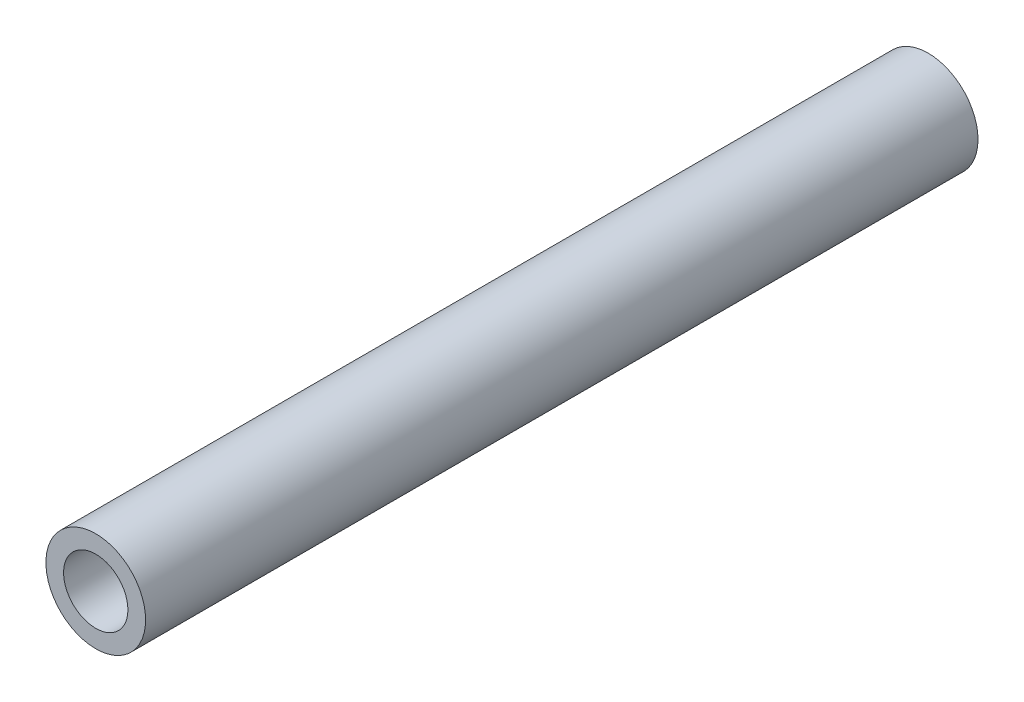
ISO-10303-21;
HEADER;
FILE_DESCRIPTION(('STEP AP214'),'2;1');
FILE_NAME('part.step','',(''),(''),'','','');
FILE_SCHEMA(('AUTOMOTIVE_DESIGN { 1 0 10303 214 1 1 1 1 }'));
ENDSEC;
DATA;
#1=APPLICATION_CONTEXT('core data for automotive mechanical design processes');
#2=APPLICATION_PROTOCOL_DEFINITION('international standard','automotive_design',2000,#1);
#3=PRODUCT_CONTEXT('',#1,'mechanical');
#4=PRODUCT('Part','Part','',(#3));
#5=PRODUCT_RELATED_PRODUCT_CATEGORY('part','',(#4));
#6=PRODUCT_DEFINITION_FORMATION('','',#4);
#7=PRODUCT_DEFINITION_CONTEXT('part definition',#1,'design');
#8=PRODUCT_DEFINITION('design','',#6,#7);
#9=PRODUCT_DEFINITION_SHAPE('','',#8);
#10=(LENGTH_UNIT() NAMED_UNIT(*) SI_UNIT(.MILLI.,.METRE.));
#11=(NAMED_UNIT(*) PLANE_ANGLE_UNIT() SI_UNIT($,.RADIAN.));
#12=(NAMED_UNIT(*) SI_UNIT($,.STERADIAN.) SOLID_ANGLE_UNIT());
#13=UNCERTAINTY_MEASURE_WITH_UNIT(LENGTH_MEASURE(1.E-05),#10,'distance_accuracy_value','');
#14=(GEOMETRIC_REPRESENTATION_CONTEXT(3) GLOBAL_UNCERTAINTY_ASSIGNED_CONTEXT((#13)) GLOBAL_UNIT_ASSIGNED_CONTEXT((#10,
#11,#12)) REPRESENTATION_CONTEXT('',''));
#15=CARTESIAN_POINT('',(0.,0.,0.));
#16=DIRECTION('',(0.,0.,1.));
#17=DIRECTION('',(1.,0.,0.));
#18=AXIS2_PLACEMENT_3D('',#15,#16,#17);
#19=CARTESIAN_POINT('',(0.,0.,66.802));
#20=DIRECTION('',(0.,0.,1.));
#21=DIRECTION('',(1.,0.,0.));
#22=AXIS2_PLACEMENT_3D('',#19,#20,#21);
#23=PLANE('',#22);
#24=CARTESIAN_POINT('',(0.,0.,66.802));
#25=DIRECTION('',(0.,0.,1.));
#26=DIRECTION('',(1.,0.,0.));
#27=AXIS2_PLACEMENT_3D('',#24,#25,#26);
#28=CIRCLE('',#27,4.);
#29=CARTESIAN_POINT('',(4.,0.,66.802));
#30=VERTEX_POINT('',#29);
#31=EDGE_CURVE('E10',#30,#30,#28,.T.);
#32=ORIENTED_EDGE('',*,*,#31,.T.);
#33=EDGE_LOOP('',(#32));
#34=FACE_BOUND('',#33,.T.);
#35=CARTESIAN_POINT('',(0.,0.,66.802));
#36=DIRECTION('',(0.,0.,1.));
#37=DIRECTION('',(1.,0.,0.));
#38=AXIS2_PLACEMENT_3D('',#35,#36,#37);
#39=CIRCLE('',#38,2.58037788044396);
#40=CARTESIAN_POINT('',(2.58037788044396,0.,66.802));
#41=VERTEX_POINT('',#40);
#42=EDGE_CURVE('E44',#41,#41,#39,.T.);
#43=ORIENTED_EDGE('',*,*,#42,.F.);
#44=EDGE_LOOP('',(#43));
#45=FACE_BOUND('',#44,.T.);
#46=ADVANCED_FACE('F33',(#34,#45),#23,.T.);
#47=CARTESIAN_POINT('',(0.,0.,0.));
#48=DIRECTION('',(0.,0.,1.));
#49=DIRECTION('',(1.,0.,0.));
#50=AXIS2_PLACEMENT_3D('',#47,#48,#49);
#51=PLANE('',#50);
#52=CARTESIAN_POINT('',(0.,0.,0.));
#53=DIRECTION('',(0.,0.,1.));
#54=DIRECTION('',(1.,0.,0.));
#55=AXIS2_PLACEMENT_3D('',#52,#53,#54);
#56=CIRCLE('',#55,4.);
#57=CARTESIAN_POINT('',(4.,0.,0.));
#58=VERTEX_POINT('',#57);
#59=EDGE_CURVE('E37',#58,#58,#56,.T.);
#60=ORIENTED_EDGE('',*,*,#59,.F.);
#61=EDGE_LOOP('',(#60));
#62=FACE_BOUND('',#61,.T.);
#63=CARTESIAN_POINT('',(0.,0.,0.));
#64=DIRECTION('',(0.,0.,1.));
#65=DIRECTION('',(1.,0.,0.));
#66=AXIS2_PLACEMENT_3D('',#63,#64,#65);
#67=CIRCLE('',#66,2.58037788044396);
#68=CARTESIAN_POINT('',(2.58037788044396,0.,0.));
#69=VERTEX_POINT('',#68);
#70=EDGE_CURVE('E46',#69,#69,#67,.T.);
#71=ORIENTED_EDGE('',*,*,#70,.T.);
#72=EDGE_LOOP('',(#71));
#73=FACE_BOUND('',#72,.T.);
#74=ADVANCED_FACE('F56',(#62,#73),#51,.F.);
#75=CARTESIAN_POINT('',(0.,0.,66.802));
#76=DIRECTION('',(0.,0.,-1.));
#77=DIRECTION('',(-1.,0.,0.));
#78=AXIS2_PLACEMENT_3D('',#75,#76,#77);
#79=CYLINDRICAL_SURFACE('',#78,4.);
#80=ORIENTED_EDGE('',*,*,#31,.F.);
#81=EDGE_LOOP('',(#80));
#82=FACE_BOUND('',#81,.T.);
#83=ORIENTED_EDGE('',*,*,#59,.T.);
#84=EDGE_LOOP('',(#83));
#85=FACE_BOUND('',#84,.T.);
#86=ADVANCED_FACE('F35',(#82,#85),#79,.T.);
#87=CARTESIAN_POINT('',(0.,0.,66.802));
#88=DIRECTION('',(0.,0.,-1.));
#89=DIRECTION('',(-1.,0.,0.));
#90=AXIS2_PLACEMENT_3D('',#87,#88,#89);
#91=CYLINDRICAL_SURFACE('',#90,2.58037788044396);
#92=ORIENTED_EDGE('',*,*,#42,.T.);
#93=EDGE_LOOP('',(#92));
#94=FACE_BOUND('',#93,.T.);
#95=ORIENTED_EDGE('',*,*,#70,.F.);
#96=EDGE_LOOP('',(#95));
#97=FACE_BOUND('',#96,.T.);
#98=ADVANCED_FACE('F52',(#94,#97),#91,.F.);
#99=CLOSED_SHELL('',(#46,#74,#86,#98));
#100=MANIFOLD_SOLID_BREP('B2',#99);
#101=ADVANCED_BREP_SHAPE_REPRESENTATION('',(#18,#100),#14);
#102=SHAPE_DEFINITION_REPRESENTATION(#9,#101);
ENDSEC;
END-ISO-10303-21;
